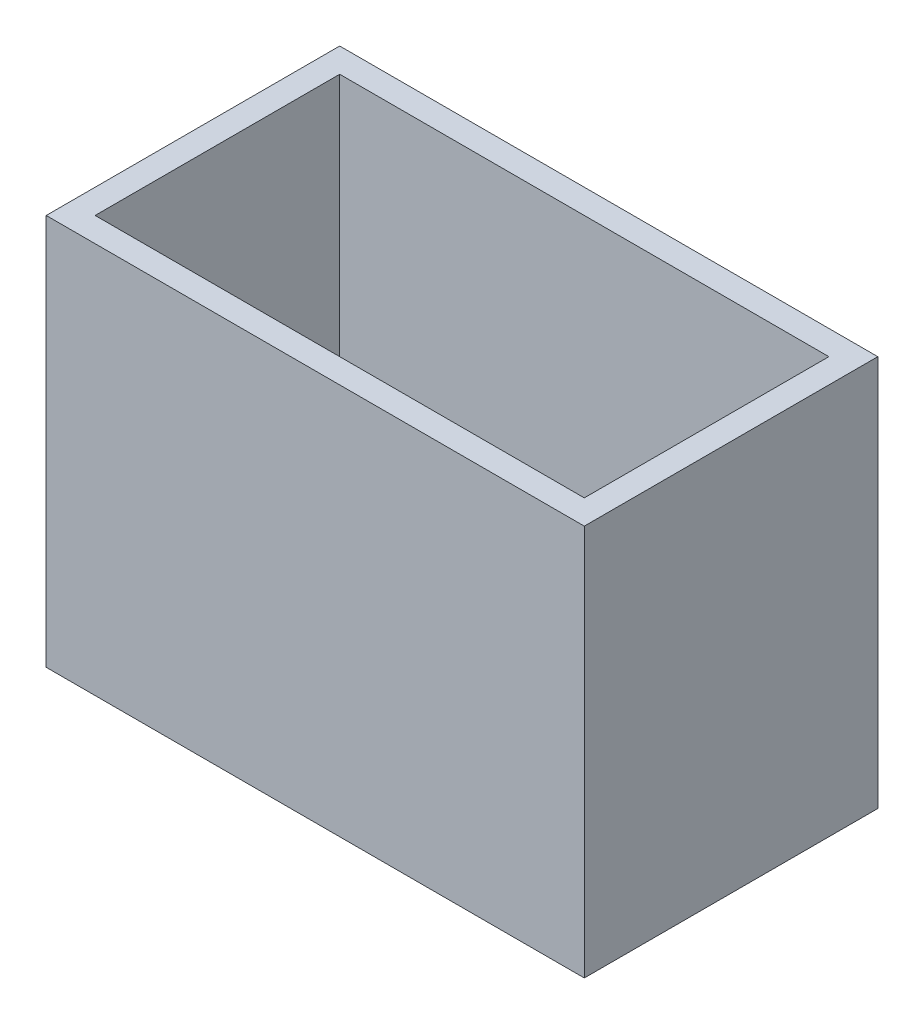
ISO-10303-21;
HEADER;
FILE_DESCRIPTION(('STEP AP214'),'2;1');
FILE_NAME('part.step','',(''),(''),'','','');
FILE_SCHEMA(('AUTOMOTIVE_DESIGN { 1 0 10303 214 1 1 1 1 }'));
ENDSEC;
DATA;
#1=APPLICATION_CONTEXT('core data for automotive mechanical design processes');
#2=APPLICATION_PROTOCOL_DEFINITION('international standard','automotive_design',2000,#1);
#3=PRODUCT_CONTEXT('',#1,'mechanical');
#4=PRODUCT('Part','Part','',(#3));
#5=PRODUCT_RELATED_PRODUCT_CATEGORY('part','',(#4));
#6=PRODUCT_DEFINITION_FORMATION('','',#4);
#7=PRODUCT_DEFINITION_CONTEXT('part definition',#1,'design');
#8=PRODUCT_DEFINITION('design','',#6,#7);
#9=PRODUCT_DEFINITION_SHAPE('','',#8);
#10=(LENGTH_UNIT() NAMED_UNIT(*) SI_UNIT(.MILLI.,.METRE.));
#11=(NAMED_UNIT(*) PLANE_ANGLE_UNIT() SI_UNIT($,.RADIAN.));
#12=(NAMED_UNIT(*) SI_UNIT($,.STERADIAN.) SOLID_ANGLE_UNIT());
#13=UNCERTAINTY_MEASURE_WITH_UNIT(LENGTH_MEASURE(1.E-05),#10,'distance_accuracy_value','');
#14=(GEOMETRIC_REPRESENTATION_CONTEXT(3) GLOBAL_UNCERTAINTY_ASSIGNED_CONTEXT((#13)) GLOBAL_UNIT_ASSIGNED_CONTEXT((#10,
#11,#12)) REPRESENTATION_CONTEXT('',''));
#15=CARTESIAN_POINT('',(0.,0.,0.));
#16=DIRECTION('',(0.,0.,1.));
#17=DIRECTION('',(1.,0.,0.));
#18=AXIS2_PLACEMENT_3D('',#15,#16,#17);
#19=CARTESIAN_POINT('',(55.,80.,30.));
#20=DIRECTION('',(-1.,0.,0.));
#21=DIRECTION('',(0.,0.,1.));
#22=AXIS2_PLACEMENT_3D('',#19,#20,#21);
#23=PLANE('',#22);
#24=DIRECTION('',(0.,0.,-1.));
#25=VECTOR('',#24,1.);
#26=CARTESIAN_POINT('',(55.,0.,30.));
#27=LINE('',#26,#25);
#28=CARTESIAN_POINT('',(55.,0.,30.));
#29=VERTEX_POINT('',#28);
#30=CARTESIAN_POINT('',(55.,0.,-30.));
#31=VERTEX_POINT('',#30);
#32=EDGE_CURVE('E140',#29,#31,#27,.T.);
#33=ORIENTED_EDGE('',*,*,#32,.T.);
#34=DIRECTION('',(0.,-1.,0.));
#35=VECTOR('',#34,1.);
#36=CARTESIAN_POINT('',(55.,80.,-30.));
#37=LINE('',#36,#35);
#38=CARTESIAN_POINT('',(55.,80.,-30.));
#39=VERTEX_POINT('',#38);
#40=EDGE_CURVE('E11',#39,#31,#37,.T.);
#41=ORIENTED_EDGE('',*,*,#40,.F.);
#42=DIRECTION('',(0.,0.,-1.));
#43=VECTOR('',#42,1.);
#44=CARTESIAN_POINT('',(55.,80.,30.));
#45=LINE('',#44,#43);
#46=CARTESIAN_POINT('',(55.,80.,30.));
#47=VERTEX_POINT('',#46);
#48=EDGE_CURVE('E144',#47,#39,#45,.T.);
#49=ORIENTED_EDGE('',*,*,#48,.F.);
#50=DIRECTION('',(0.,-1.,0.));
#51=VECTOR('',#50,1.);
#52=CARTESIAN_POINT('',(55.,80.,30.));
#53=LINE('',#52,#51);
#54=EDGE_CURVE('E150',#47,#29,#53,.T.);
#55=ORIENTED_EDGE('',*,*,#54,.T.);
#56=EDGE_LOOP('',(#33,#41,#49,#55));
#57=FACE_BOUND('',#56,.T.);
#58=ADVANCED_FACE('F32',(#57),#23,.F.);
#59=CARTESIAN_POINT('',(-55.,80.,-30.));
#60=DIRECTION('',(0.,0.,1.));
#61=DIRECTION('',(1.,0.,0.));
#62=AXIS2_PLACEMENT_3D('',#59,#60,#61);
#63=PLANE('',#62);
#64=DIRECTION('',(-1.,0.,0.));
#65=VECTOR('',#64,1.);
#66=CARTESIAN_POINT('',(-55.,0.,-30.));
#67=LINE('',#66,#65);
#68=CARTESIAN_POINT('',(-55.,0.,-30.));
#69=VERTEX_POINT('',#68);
#70=EDGE_CURVE('E153',#31,#69,#67,.T.);
#71=ORIENTED_EDGE('',*,*,#70,.T.);
#72=DIRECTION('',(0.,-1.,0.));
#73=VECTOR('',#72,1.);
#74=CARTESIAN_POINT('',(-55.,80.,-30.));
#75=LINE('',#74,#73);
#76=CARTESIAN_POINT('',(-55.,80.,-30.));
#77=VERTEX_POINT('',#76);
#78=EDGE_CURVE('E39',#77,#69,#75,.T.);
#79=ORIENTED_EDGE('',*,*,#78,.F.);
#80=DIRECTION('',(-1.,0.,0.));
#81=VECTOR('',#80,1.);
#82=CARTESIAN_POINT('',(-55.,80.,-30.));
#83=LINE('',#82,#81);
#84=EDGE_CURVE('E83',#39,#77,#83,.T.);
#85=ORIENTED_EDGE('',*,*,#84,.F.);
#86=ORIENTED_EDGE('',*,*,#40,.T.);
#87=EDGE_LOOP('',(#71,#79,#85,#86));
#88=FACE_BOUND('',#87,.T.);
#89=ADVANCED_FACE('F182',(#88),#63,.F.);
#90=CARTESIAN_POINT('',(-55.,80.,30.));
#91=DIRECTION('',(1.,0.,0.));
#92=DIRECTION('',(0.,0.,-1.));
#93=AXIS2_PLACEMENT_3D('',#90,#91,#92);
#94=PLANE('',#93);
#95=DIRECTION('',(0.,0.,1.));
#96=VECTOR('',#95,1.);
#97=CARTESIAN_POINT('',(-55.,0.,30.));
#98=LINE('',#97,#96);
#99=CARTESIAN_POINT('',(-55.,0.,30.));
#100=VERTEX_POINT('',#99);
#101=EDGE_CURVE('E155',#69,#100,#98,.T.);
#102=ORIENTED_EDGE('',*,*,#101,.T.);
#103=DIRECTION('',(0.,-1.,0.));
#104=VECTOR('',#103,1.);
#105=CARTESIAN_POINT('',(-55.,80.,30.));
#106=LINE('',#105,#104);
#107=CARTESIAN_POINT('',(-55.,80.,30.));
#108=VERTEX_POINT('',#107);
#109=EDGE_CURVE('E159',#108,#100,#106,.T.);
#110=ORIENTED_EDGE('',*,*,#109,.F.);
#111=DIRECTION('',(0.,0.,1.));
#112=VECTOR('',#111,1.);
#113=CARTESIAN_POINT('',(-55.,80.,30.));
#114=LINE('',#113,#112);
#115=EDGE_CURVE('E147',#77,#108,#114,.T.);
#116=ORIENTED_EDGE('',*,*,#115,.F.);
#117=ORIENTED_EDGE('',*,*,#78,.T.);
#118=EDGE_LOOP('',(#102,#110,#116,#117));
#119=FACE_BOUND('',#118,.T.);
#120=ADVANCED_FACE('F164',(#119),#94,.F.);
#121=CARTESIAN_POINT('',(-55.,80.,30.));
#122=DIRECTION('',(0.,0.,-1.));
#123=DIRECTION('',(-1.,0.,0.));
#124=AXIS2_PLACEMENT_3D('',#121,#122,#123);
#125=PLANE('',#124);
#126=DIRECTION('',(1.,0.,0.));
#127=VECTOR('',#126,1.);
#128=CARTESIAN_POINT('',(-55.,0.,30.));
#129=LINE('',#128,#127);
#130=EDGE_CURVE('E76',#100,#29,#129,.T.);
#131=ORIENTED_EDGE('',*,*,#130,.T.);
#132=ORIENTED_EDGE('',*,*,#54,.F.);
#133=DIRECTION('',(1.,0.,0.));
#134=VECTOR('',#133,1.);
#135=CARTESIAN_POINT('',(-55.,80.,30.));
#136=LINE('',#135,#134);
#137=EDGE_CURVE('E55',#108,#47,#136,.T.);
#138=ORIENTED_EDGE('',*,*,#137,.F.);
#139=ORIENTED_EDGE('',*,*,#109,.T.);
#140=EDGE_LOOP('',(#131,#132,#138,#139));
#141=FACE_BOUND('',#140,.T.);
#142=ADVANCED_FACE('F172',(#141),#125,.F.);
#143=CARTESIAN_POINT('',(0.,80.,0.));
#144=DIRECTION('',(0.,-1.,0.));
#145=DIRECTION('',(0.,0.,-1.));
#146=AXIS2_PLACEMENT_3D('',#143,#144,#145);
#147=PLANE('',#146);
#148=DIRECTION('',(-1.,0.,0.));
#149=VECTOR('',#148,1.);
#150=CARTESIAN_POINT('',(-50.,80.,-25.));
#151=LINE('',#150,#149);
#152=CARTESIAN_POINT('',(50.,80.,-25.));
#153=VERTEX_POINT('',#152);
#154=CARTESIAN_POINT('',(-50.,80.,-25.));
#155=VERTEX_POINT('',#154);
#156=EDGE_CURVE('E134',#153,#155,#151,.T.);
#157=ORIENTED_EDGE('',*,*,#156,.F.);
#158=DIRECTION('',(0.,0.,-1.));
#159=VECTOR('',#158,1.);
#160=CARTESIAN_POINT('',(50.,80.,25.));
#161=LINE('',#160,#159);
#162=CARTESIAN_POINT('',(50.,80.,25.));
#163=VERTEX_POINT('',#162);
#164=EDGE_CURVE('E46',#163,#153,#161,.T.);
#165=ORIENTED_EDGE('',*,*,#164,.F.);
#166=DIRECTION('',(1.,0.,0.));
#167=VECTOR('',#166,1.);
#168=CARTESIAN_POINT('',(-50.,80.,25.));
#169=LINE('',#168,#167);
#170=CARTESIAN_POINT('',(-50.,80.,25.));
#171=VERTEX_POINT('',#170);
#172=EDGE_CURVE('E125',#171,#163,#169,.T.);
#173=ORIENTED_EDGE('',*,*,#172,.F.);
#174=DIRECTION('',(0.,0.,1.));
#175=VECTOR('',#174,1.);
#176=CARTESIAN_POINT('',(-50.,80.,25.));
#177=LINE('',#176,#175);
#178=EDGE_CURVE('E128',#155,#171,#177,.T.);
#179=ORIENTED_EDGE('',*,*,#178,.F.);
#180=EDGE_LOOP('',(#157,#165,#173,#179));
#181=FACE_BOUND('',#180,.T.);
#182=ORIENTED_EDGE('',*,*,#48,.T.);
#183=ORIENTED_EDGE('',*,*,#84,.T.);
#184=ORIENTED_EDGE('',*,*,#115,.T.);
#185=ORIENTED_EDGE('',*,*,#137,.T.);
#186=EDGE_LOOP('',(#182,#183,#184,#185));
#187=FACE_BOUND('',#186,.T.);
#188=ADVANCED_FACE('F174',(#181,#187),#147,.F.);
#189=CARTESIAN_POINT('',(0.,0.,0.));
#190=DIRECTION('',(0.,-1.,0.));
#191=DIRECTION('',(0.,0.,-1.));
#192=AXIS2_PLACEMENT_3D('',#189,#190,#191);
#193=PLANE('',#192);
#194=ORIENTED_EDGE('',*,*,#32,.F.);
#195=ORIENTED_EDGE('',*,*,#130,.F.);
#196=ORIENTED_EDGE('',*,*,#101,.F.);
#197=ORIENTED_EDGE('',*,*,#70,.F.);
#198=EDGE_LOOP('',(#194,#195,#196,#197));
#199=FACE_BOUND('',#198,.T.);
#200=ADVANCED_FACE('F168',(#199),#193,.T.);
#201=CARTESIAN_POINT('',(50.,5.,25.));
#202=DIRECTION('',(1.,0.,0.));
#203=DIRECTION('',(0.,0.,-1.));
#204=AXIS2_PLACEMENT_3D('',#201,#202,#203);
#205=PLANE('',#204);
#206=ORIENTED_EDGE('',*,*,#164,.T.);
#207=DIRECTION('',(0.,1.,0.));
#208=VECTOR('',#207,1.);
#209=CARTESIAN_POINT('',(50.,5.,-25.));
#210=LINE('',#209,#208);
#211=CARTESIAN_POINT('',(50.,5.,-25.));
#212=VERTEX_POINT('',#211);
#213=EDGE_CURVE('E103',#212,#153,#210,.T.);
#214=ORIENTED_EDGE('',*,*,#213,.F.);
#215=DIRECTION('',(0.,0.,-1.));
#216=VECTOR('',#215,1.);
#217=CARTESIAN_POINT('',(50.,5.,25.));
#218=LINE('',#217,#216);
#219=CARTESIAN_POINT('',(50.,5.,25.));
#220=VERTEX_POINT('',#219);
#221=EDGE_CURVE('E107',#220,#212,#218,.T.);
#222=ORIENTED_EDGE('',*,*,#221,.F.);
#223=DIRECTION('',(0.,1.,0.));
#224=VECTOR('',#223,1.);
#225=CARTESIAN_POINT('',(50.,5.,25.));
#226=LINE('',#225,#224);
#227=EDGE_CURVE('E138',#220,#163,#226,.T.);
#228=ORIENTED_EDGE('',*,*,#227,.T.);
#229=EDGE_LOOP('',(#206,#214,#222,#228));
#230=FACE_BOUND('',#229,.T.);
#231=ADVANCED_FACE('F105',(#230),#205,.F.);
#232=CARTESIAN_POINT('',(-50.,5.,25.));
#233=DIRECTION('',(0.,0.,1.));
#234=DIRECTION('',(1.,0.,0.));
#235=AXIS2_PLACEMENT_3D('',#232,#233,#234);
#236=PLANE('',#235);
#237=ORIENTED_EDGE('',*,*,#172,.T.);
#238=ORIENTED_EDGE('',*,*,#227,.F.);
#239=DIRECTION('',(1.,0.,0.));
#240=VECTOR('',#239,1.);
#241=CARTESIAN_POINT('',(-50.,5.,25.));
#242=LINE('',#241,#240);
#243=CARTESIAN_POINT('',(-50.,5.,25.));
#244=VERTEX_POINT('',#243);
#245=EDGE_CURVE('E113',#244,#220,#242,.T.);
#246=ORIENTED_EDGE('',*,*,#245,.F.);
#247=DIRECTION('',(0.,1.,0.));
#248=VECTOR('',#247,1.);
#249=CARTESIAN_POINT('',(-50.,5.,25.));
#250=LINE('',#249,#248);
#251=EDGE_CURVE('E141',#244,#171,#250,.T.);
#252=ORIENTED_EDGE('',*,*,#251,.T.);
#253=EDGE_LOOP('',(#237,#238,#246,#252));
#254=FACE_BOUND('',#253,.T.);
#255=ADVANCED_FACE('F221',(#254),#236,.F.);
#256=CARTESIAN_POINT('',(-50.,5.,25.));
#257=DIRECTION('',(-1.,0.,0.));
#258=DIRECTION('',(0.,0.,1.));
#259=AXIS2_PLACEMENT_3D('',#256,#257,#258);
#260=PLANE('',#259);
#261=ORIENTED_EDGE('',*,*,#178,.T.);
#262=ORIENTED_EDGE('',*,*,#251,.F.);
#263=DIRECTION('',(0.,0.,1.));
#264=VECTOR('',#263,1.);
#265=CARTESIAN_POINT('',(-50.,5.,25.));
#266=LINE('',#265,#264);
#267=CARTESIAN_POINT('',(-50.,5.,-25.));
#268=VERTEX_POINT('',#267);
#269=EDGE_CURVE('E121',#268,#244,#266,.T.);
#270=ORIENTED_EDGE('',*,*,#269,.F.);
#271=DIRECTION('',(0.,1.,0.));
#272=VECTOR('',#271,1.);
#273=CARTESIAN_POINT('',(-50.,5.,-25.));
#274=LINE('',#273,#272);
#275=EDGE_CURVE('E112',#268,#155,#274,.T.);
#276=ORIENTED_EDGE('',*,*,#275,.T.);
#277=EDGE_LOOP('',(#261,#262,#270,#276));
#278=FACE_BOUND('',#277,.T.);
#279=ADVANCED_FACE('F230',(#278),#260,.F.);
#280=CARTESIAN_POINT('',(-50.,5.,-25.));
#281=DIRECTION('',(0.,0.,-1.));
#282=DIRECTION('',(-1.,0.,0.));
#283=AXIS2_PLACEMENT_3D('',#280,#281,#282);
#284=PLANE('',#283);
#285=ORIENTED_EDGE('',*,*,#156,.T.);
#286=ORIENTED_EDGE('',*,*,#275,.F.);
#287=DIRECTION('',(-1.,0.,0.));
#288=VECTOR('',#287,1.);
#289=CARTESIAN_POINT('',(-50.,5.,-25.));
#290=LINE('',#289,#288);
#291=EDGE_CURVE('E116',#212,#268,#290,.T.);
#292=ORIENTED_EDGE('',*,*,#291,.F.);
#293=ORIENTED_EDGE('',*,*,#213,.T.);
#294=EDGE_LOOP('',(#285,#286,#292,#293));
#295=FACE_BOUND('',#294,.T.);
#296=ADVANCED_FACE('F117',(#295),#284,.F.);
#297=CARTESIAN_POINT('',(0.,5.,0.));
#298=DIRECTION('',(0.,-1.,0.));
#299=DIRECTION('',(0.,0.,-1.));
#300=AXIS2_PLACEMENT_3D('',#297,#298,#299);
#301=PLANE('',#300);
#302=ORIENTED_EDGE('',*,*,#221,.T.);
#303=ORIENTED_EDGE('',*,*,#291,.T.);
#304=ORIENTED_EDGE('',*,*,#269,.T.);
#305=ORIENTED_EDGE('',*,*,#245,.T.);
#306=EDGE_LOOP('',(#302,#303,#304,#305));
#307=FACE_BOUND('',#306,.T.);
#308=ADVANCED_FACE('F123',(#307),#301,.F.);
#309=CLOSED_SHELL('',(#58,#89,#120,#142,#188,#200,#231,#255,#279,#296,#308));
#310=MANIFOLD_SOLID_BREP('B2',#309);
#311=ADVANCED_BREP_SHAPE_REPRESENTATION('',(#18,#310),#14);
#312=SHAPE_DEFINITION_REPRESENTATION(#9,#311);
ENDSEC;
END-ISO-10303-21;
